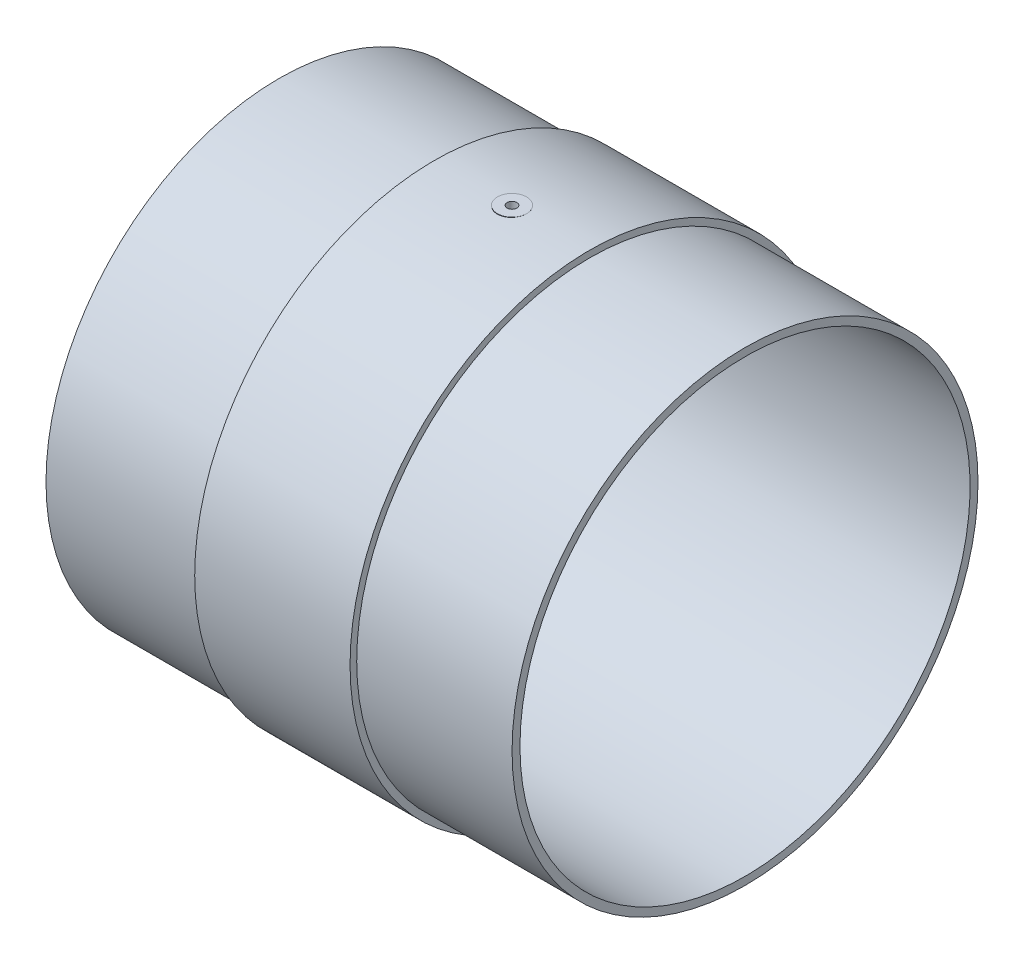
ISO-10303-21;
HEADER;
FILE_DESCRIPTION(('STEP AP214'),'2;1');
FILE_NAME('part.step','',(''),(''),'','','');
FILE_SCHEMA(('AUTOMOTIVE_DESIGN { 1 0 10303 214 1 1 1 1 }'));
ENDSEC;
DATA;
#1=APPLICATION_CONTEXT('core data for automotive mechanical design processes');
#2=APPLICATION_PROTOCOL_DEFINITION('international standard','automotive_design',2000,#1);
#3=PRODUCT_CONTEXT('',#1,'mechanical');
#4=PRODUCT('Part','Part','',(#3));
#5=PRODUCT_RELATED_PRODUCT_CATEGORY('part','',(#4));
#6=PRODUCT_DEFINITION_FORMATION('','',#4);
#7=PRODUCT_DEFINITION_CONTEXT('part definition',#1,'design');
#8=PRODUCT_DEFINITION('design','',#6,#7);
#9=PRODUCT_DEFINITION_SHAPE('','',#8);
#10=(LENGTH_UNIT() NAMED_UNIT(*) SI_UNIT(.MILLI.,.METRE.));
#11=(NAMED_UNIT(*) PLANE_ANGLE_UNIT() SI_UNIT($,.RADIAN.));
#12=(NAMED_UNIT(*) SI_UNIT($,.STERADIAN.) SOLID_ANGLE_UNIT());
#13=UNCERTAINTY_MEASURE_WITH_UNIT(LENGTH_MEASURE(1.E-05),#10,'distance_accuracy_value','');
#14=(GEOMETRIC_REPRESENTATION_CONTEXT(3) GLOBAL_UNCERTAINTY_ASSIGNED_CONTEXT((#13)) GLOBAL_UNIT_ASSIGNED_CONTEXT((#10,
#11,#12)) REPRESENTATION_CONTEXT('',''));
#15=CARTESIAN_POINT('',(0.,0.,0.));
#16=DIRECTION('',(0.,0.,1.));
#17=DIRECTION('',(1.,0.,0.));
#18=AXIS2_PLACEMENT_3D('',#15,#16,#17);
#19=CARTESIAN_POINT('',(-6.35,150.114,0.));
#20=DIRECTION('',(0.,-1.,0.));
#21=DIRECTION('',(0.,0.,-1.));
#22=AXIS2_PLACEMENT_3D('',#19,#20,#21);
#23=PLANE('',#22);
#24=CARTESIAN_POINT('',(0.,150.114,0.));
#25=DIRECTION('',(0.,-1.,0.));
#26=DIRECTION('',(0.,0.,-1.));
#27=AXIS2_PLACEMENT_3D('',#24,#25,#26);
#28=CIRCLE('',#27,9.525);
#29=CARTESIAN_POINT('',(0.,150.114,-9.525));
#30=VERTEX_POINT('',#29);
#31=EDGE_CURVE('E11',#30,#30,#28,.T.);
#32=ORIENTED_EDGE('',*,*,#31,.F.);
#33=EDGE_LOOP('',(#32));
#34=FACE_BOUND('',#33,.T.);
#35=CARTESIAN_POINT('',(0.,150.114,0.));
#36=DIRECTION('',(0.,-1.,0.));
#37=DIRECTION('',(0.,0.,-1.));
#38=AXIS2_PLACEMENT_3D('',#35,#36,#37);
#39=CIRCLE('',#38,6.35);
#40=CARTESIAN_POINT('',(0.,150.114,-6.35));
#41=VERTEX_POINT('',#40);
#42=EDGE_CURVE('E80',#41,#41,#39,.T.);
#43=ORIENTED_EDGE('',*,*,#42,.T.);
#44=EDGE_LOOP('',(#43));
#45=FACE_BOUND('',#44,.T.);
#46=ADVANCED_FACE('F52',(#34,#45),#23,.F.);
#47=CARTESIAN_POINT('',(0.,0.,0.));
#48=DIRECTION('',(0.,-1.,0.));
#49=DIRECTION('',(0.,0.,-1.));
#50=AXIS2_PLACEMENT_3D('',#47,#48,#49);
#51=CYLINDRICAL_SURFACE('',#50,9.525);
#52=CARTESIAN_POINT('',(0.,146.812,0.));
#53=DIRECTION('',(0.,-1.,0.));
#54=DIRECTION('',(0.,0.,-1.));
#55=AXIS2_PLACEMENT_3D('',#52,#53,#54);
#56=CIRCLE('',#55,9.525);
#57=CARTESIAN_POINT('',(0.,146.812,-9.525));
#58=VERTEX_POINT('',#57);
#59=EDGE_CURVE('E58',#58,#58,#56,.T.);
#60=ORIENTED_EDGE('',*,*,#59,.F.);
#61=EDGE_LOOP('',(#60));
#62=FACE_BOUND('',#61,.T.);
#63=ORIENTED_EDGE('',*,*,#31,.T.);
#64=EDGE_LOOP('',(#63));
#65=FACE_BOUND('',#64,.T.);
#66=ADVANCED_FACE('F117',(#62,#65),#51,.T.);
#67=CARTESIAN_POINT('',(-9.525,146.812,0.));
#68=DIRECTION('',(0.,1.,0.));
#69=DIRECTION('',(0.,0.,1.));
#70=AXIS2_PLACEMENT_3D('',#67,#68,#69);
#71=PLANE('',#70);
#72=CARTESIAN_POINT('',(0.,146.812,0.));
#73=DIRECTION('',(0.,-1.,0.));
#74=DIRECTION('',(0.,0.,-1.));
#75=AXIS2_PLACEMENT_3D('',#72,#73,#74);
#76=CIRCLE('',#75,3.175);
#77=CARTESIAN_POINT('',(0.,146.812,-3.175));
#78=VERTEX_POINT('',#77);
#79=EDGE_CURVE('E62',#78,#78,#76,.T.);
#80=ORIENTED_EDGE('',*,*,#79,.F.);
#81=EDGE_LOOP('',(#80));
#82=FACE_BOUND('',#81,.T.);
#83=ORIENTED_EDGE('',*,*,#59,.T.);
#84=EDGE_LOOP('',(#83));
#85=FACE_BOUND('',#84,.T.);
#86=ADVANCED_FACE('F112',(#82,#85),#71,.F.);
#87=CARTESIAN_POINT('',(0.,0.,0.));
#88=DIRECTION('',(0.,-1.,0.));
#89=DIRECTION('',(0.,0.,-1.));
#90=AXIS2_PLACEMENT_3D('',#87,#88,#89);
#91=CYLINDRICAL_SURFACE('',#90,3.175);
#92=CARTESIAN_POINT('',(0.,156.718,0.));
#93=DIRECTION('',(0.,-1.,0.));
#94=DIRECTION('',(0.,0.,-1.));
#95=AXIS2_PLACEMENT_3D('',#92,#93,#94);
#96=CIRCLE('',#95,3.175);
#97=CARTESIAN_POINT('',(0.,156.718,-3.175));
#98=VERTEX_POINT('',#97);
#99=EDGE_CURVE('E66',#98,#98,#96,.T.);
#100=ORIENTED_EDGE('',*,*,#99,.F.);
#101=EDGE_LOOP('',(#100));
#102=FACE_BOUND('',#101,.T.);
#103=ORIENTED_EDGE('',*,*,#79,.T.);
#104=EDGE_LOOP('',(#103));
#105=FACE_BOUND('',#104,.T.);
#106=ADVANCED_FACE('F106',(#102,#105),#91,.F.);
#107=CARTESIAN_POINT('',(-3.175,156.718,0.));
#108=DIRECTION('',(0.,-1.,0.));
#109=DIRECTION('',(0.,0.,-1.));
#110=AXIS2_PLACEMENT_3D('',#107,#108,#109);
#111=PLANE('',#110);
#112=CARTESIAN_POINT('',(0.,156.718,0.));
#113=DIRECTION('',(0.,-1.,0.));
#114=DIRECTION('',(0.,0.,-1.));
#115=AXIS2_PLACEMENT_3D('',#112,#113,#114);
#116=CIRCLE('',#115,9.525);
#117=CARTESIAN_POINT('',(0.,156.718,-9.525));
#118=VERTEX_POINT('',#117);
#119=EDGE_CURVE('E71',#118,#118,#116,.T.);
#120=ORIENTED_EDGE('',*,*,#119,.F.);
#121=EDGE_LOOP('',(#120));
#122=FACE_BOUND('',#121,.T.);
#123=ORIENTED_EDGE('',*,*,#99,.T.);
#124=EDGE_LOOP('',(#123));
#125=FACE_BOUND('',#124,.T.);
#126=ADVANCED_FACE('F100',(#122,#125),#111,.F.);
#127=CARTESIAN_POINT('',(0.,0.,0.));
#128=DIRECTION('',(0.,-1.,0.));
#129=DIRECTION('',(0.,0.,-1.));
#130=AXIS2_PLACEMENT_3D('',#127,#128,#129);
#131=CYLINDRICAL_SURFACE('',#130,9.525);
#132=CARTESIAN_POINT('',(0.,153.416,0.));
#133=DIRECTION('',(0.,-1.,0.));
#134=DIRECTION('',(0.,0.,-1.));
#135=AXIS2_PLACEMENT_3D('',#132,#133,#134);
#136=CIRCLE('',#135,9.525);
#137=CARTESIAN_POINT('',(0.,153.416,-9.525));
#138=VERTEX_POINT('',#137);
#139=EDGE_CURVE('E74',#138,#138,#136,.T.);
#140=ORIENTED_EDGE('',*,*,#139,.F.);
#141=EDGE_LOOP('',(#140));
#142=FACE_BOUND('',#141,.T.);
#143=ORIENTED_EDGE('',*,*,#119,.T.);
#144=EDGE_LOOP('',(#143));
#145=FACE_BOUND('',#144,.T.);
#146=ADVANCED_FACE('F94',(#142,#145),#131,.T.);
#147=CARTESIAN_POINT('',(-9.525,153.416,0.));
#148=DIRECTION('',(0.,1.,0.));
#149=DIRECTION('',(0.,0.,1.));
#150=AXIS2_PLACEMENT_3D('',#147,#148,#149);
#151=PLANE('',#150);
#152=CARTESIAN_POINT('',(0.,153.416,0.));
#153=DIRECTION('',(0.,-1.,0.));
#154=DIRECTION('',(0.,0.,-1.));
#155=AXIS2_PLACEMENT_3D('',#152,#153,#154);
#156=CIRCLE('',#155,6.35);
#157=CARTESIAN_POINT('',(0.,153.416,-6.35));
#158=VERTEX_POINT('',#157);
#159=EDGE_CURVE('E77',#158,#158,#156,.T.);
#160=ORIENTED_EDGE('',*,*,#159,.F.);
#161=EDGE_LOOP('',(#160));
#162=FACE_BOUND('',#161,.T.);
#163=ORIENTED_EDGE('',*,*,#139,.T.);
#164=EDGE_LOOP('',(#163));
#165=FACE_BOUND('',#164,.T.);
#166=ADVANCED_FACE('F88',(#162,#165),#151,.F.);
#167=CARTESIAN_POINT('',(0.,0.,0.));
#168=DIRECTION('',(0.,-1.,0.));
#169=DIRECTION('',(0.,0.,-1.));
#170=AXIS2_PLACEMENT_3D('',#167,#168,#169);
#171=CYLINDRICAL_SURFACE('',#170,6.35);
#172=ORIENTED_EDGE('',*,*,#42,.F.);
#173=EDGE_LOOP('',(#172));
#174=FACE_BOUND('',#173,.T.);
#175=ORIENTED_EDGE('',*,*,#159,.T.);
#176=EDGE_LOOP('',(#175));
#177=FACE_BOUND('',#176,.T.);
#178=ADVANCED_FACE('F85',(#174,#177),#171,.T.);
#179=CLOSED_SHELL('',(#46,#66,#86,#106,#126,#146,#166,#178));
#180=MANIFOLD_SOLID_BREP('B2',#179);
#181=CARTESIAN_POINT('',(-149.452065875916,0.,0.));
#182=DIRECTION('',(-1.,0.,0.));
#183=DIRECTION('',(0.,0.,1.));
#184=AXIS2_PLACEMENT_3D('',#181,#182,#183);
#185=CYLINDRICAL_SURFACE('',#184,156.718);
#186=CARTESIAN_POINT('',(50.8,0.,0.));
#187=DIRECTION('',(-1.,0.,0.));
#188=DIRECTION('',(0.,0.,1.));
#189=AXIS2_PLACEMENT_3D('',#186,#187,#188);
#190=CIRCLE('',#189,156.718);
#191=CARTESIAN_POINT('',(50.8,0.,156.718));
#192=VERTEX_POINT('',#191);
#193=EDGE_CURVE('E203',#192,#192,#190,.T.);
#194=ORIENTED_EDGE('',*,*,#193,.T.);
#195=EDGE_LOOP('',(#194));
#196=FACE_BOUND('',#195,.T.);
#197=CARTESIAN_POINT('',(-50.8,0.,0.));
#198=DIRECTION('',(-1.,0.,0.));
#199=DIRECTION('',(0.,0.,1.));
#200=AXIS2_PLACEMENT_3D('',#197,#198,#199);
#201=CIRCLE('',#200,156.718);
#202=CARTESIAN_POINT('',(-50.8,0.,156.718));
#203=VERTEX_POINT('',#202);
#204=EDGE_CURVE('E184',#203,#203,#201,.T.);
#205=ORIENTED_EDGE('',*,*,#204,.F.);
#206=EDGE_LOOP('',(#205));
#207=FACE_BOUND('',#206,.T.);
#208=CARTESIAN_POINT('',(-9.525,156.718,0.));
#209=CARTESIAN_POINT('',(-9.52500217038105,156.718000363997,-0.267342653931346));
#210=CARTESIAN_POINT('',(-9.51374006126548,156.717314496973,-0.534650645836345));
#211=CARTESIAN_POINT('',(-9.46877206428019,156.714590966698,-1.0674521592862));
#212=CARTESIAN_POINT('',(-9.43506046412577,156.712552959394,-1.33294520164153));
#213=CARTESIAN_POINT('',(-9.34538119796286,156.707179324834,-1.86040900175887));
#214=CARTESIAN_POINT('',(-9.28939061322089,156.703842361398,-2.12237584426583));
#215=CARTESIAN_POINT('',(-9.15555575880944,156.695965619827,-2.64065400372578));
#216=CARTESIAN_POINT('',(-9.07771109362001,156.691425819923,-2.89696521823141));
#217=CARTESIAN_POINT('',(-8.90077478669608,156.681274890491,-3.4019668715211));
#218=CARTESIAN_POINT('',(-8.80169471605812,156.67566434459,-3.65066137661179));
#219=CARTESIAN_POINT('',(-8.58296878393986,156.663529056122,-4.13881710348228));
#220=CARTESIAN_POINT('',(-8.46332261038837,156.657004299682,-4.37827818508608));
#221=CARTESIAN_POINT('',(-8.20434879748069,156.643226894244,-4.8462125782748));
#222=CARTESIAN_POINT('',(-8.06502588982297,156.635974420362,-5.07468851382289));
#223=CARTESIAN_POINT('',(-7.76766580153529,156.620945251332,-5.51910088404581));
#224=CARTESIAN_POINT('',(-7.60962859540934,156.613168555471,-5.73503730163646));
#225=CARTESIAN_POINT('',(-7.27574945752687,156.597300739157,-6.15310890933161));
#226=CARTESIAN_POINT('',(-7.09988543836088,156.589209236496,-6.35522644588332));
#227=CARTESIAN_POINT('',(-6.73176364425395,156.572950215034,-6.74393320866708));
#228=CARTESIAN_POINT('',(-6.53950584127373,156.564782696102,-6.930522408339));
#229=CARTESIAN_POINT('',(-6.13994669232155,156.548602697898,-7.28686073514025));
#230=CARTESIAN_POINT('',(-5.93264456570472,156.540590226698,-7.45660898731512));
#231=CARTESIAN_POINT('',(-5.504476690543,156.524948181221,-7.77804746991813));
#232=CARTESIAN_POINT('',(-5.2836112326182,156.517318598746,-7.92973808706084));
#233=CARTESIAN_POINT('',(-4.82969967928947,156.502653054159,-8.21409796394327));
#234=CARTESIAN_POINT('',(-4.59664428799725,156.495617556099,-8.34675240964369));
#235=CARTESIAN_POINT('',(-4.12016322033992,156.482347050259,-8.59195376475454));
#236=CARTESIAN_POINT('',(-3.87673753670875,156.476112043038,-8.70450066007611));
#237=CARTESIAN_POINT('',(-3.38124747226781,156.46462027337,-8.90868058606694));
#238=CARTESIAN_POINT('',(-3.12918316364767,156.45936350275,-9.00031379145478));
#239=CARTESIAN_POINT('',(-2.61820791887208,156.449978160705,-9.16200973128242));
#240=CARTESIAN_POINT('',(-2.35929699171926,156.445849587796,-9.23207249408372));
#241=CARTESIAN_POINT('',(-1.83680021055349,156.438842955022,-9.35004978461616));
#242=CARTESIAN_POINT('',(-1.57322058948629,156.435963342023,-9.39799182515209));
#243=CARTESIAN_POINT('',(-1.04294948207278,156.431529283601,-9.47151145810046));
#244=CARTESIAN_POINT('',(-0.776257998044552,156.429974837192,-9.49708906717163));
#245=CARTESIAN_POINT('',(-0.241666571794378,156.42823548646,-9.52569541802202));
#246=CARTESIAN_POINT('',(0.0262333586139533,156.428050568777,-9.52872437975801));
#247=CARTESIAN_POINT('',(0.561334042864808,156.429055521931,-9.51221216623992));
#248=CARTESIAN_POINT('',(0.828534797200157,156.430245391798,-9.49267100689908));
#249=CARTESIAN_POINT('',(1.3599783854429,156.433963468585,-9.43120043040231));
#250=CARTESIAN_POINT('',(1.62422468133251,156.436489893054,-9.38930083018199));
#251=CARTESIAN_POINT('',(2.14824306084206,156.442808093993,-9.28343295826614));
#252=CARTESIAN_POINT('',(2.40801514905794,156.446599869165,-9.21946470924111));
#253=CARTESIAN_POINT('',(2.92124347121409,156.45534099067,-9.0699175263147));
#254=CARTESIAN_POINT('',(3.17469967812647,156.460290341957,-8.98433849995061));
#255=CARTESIAN_POINT('',(3.67350011626747,156.4712060537,-8.79218139501373));
#256=CARTESIAN_POINT('',(3.91884433937325,156.477172415175,-8.68560329541451));
#257=CARTESIAN_POINT('',(4.39984617959543,156.48995718139,-8.45212957919197));
#258=CARTESIAN_POINT('',(4.63549723218772,156.496776151317,-8.32522046946886));
#259=CARTESIAN_POINT('',(5.09527332944085,156.511069583777,-8.05203828396552));
#260=CARTESIAN_POINT('',(5.31939837076128,156.518544046499,-7.90576520257338));
#261=CARTESIAN_POINT('',(5.75454180669173,156.533936773134,-7.59489120114708));
#262=CARTESIAN_POINT('',(5.96556008390504,156.54185504102,-7.43029011698668));
#263=CARTESIAN_POINT('',(6.37299864791713,156.557911211831,-7.08392596316644));
#264=CARTESIAN_POINT('',(6.56941891896868,156.566049114991,-6.90216287499402));
#265=CARTESIAN_POINT('',(6.9465809131596,156.582327612934,-6.52245066601622));
#266=CARTESIAN_POINT('',(7.12729667054476,156.590468190645,-6.32447575208424));
#267=CARTESIAN_POINT('',(7.47141056551634,156.606507926566,-5.91399829641452));
#268=CARTESIAN_POINT('',(7.63480868310718,156.614407084497,-5.7014957379031));
#269=CARTESIAN_POINT('',(7.94312701307535,156.629739990421,-5.2634675290488));
#270=CARTESIAN_POINT('',(8.08804720628557,156.63717373793,-5.03794186519745));
#271=CARTESIAN_POINT('',(8.35837782210742,156.651364980317,-4.57546563607123));
#272=CARTESIAN_POINT('',(8.48378825442525,156.658122475531,-4.33851507648039));
#273=CARTESIAN_POINT('',(8.71420992092635,156.670769804193,-3.85485777972268));
#274=CARTESIAN_POINT('',(8.81922014740766,156.676659594776,-3.60815056133362));
#275=CARTESIAN_POINT('',(9.0080817730687,156.687403899691,-3.10674379644892));
#276=CARTESIAN_POINT('',(9.09193316762588,156.692258413796,-2.85204424820723));
#277=CARTESIAN_POINT('',(9.23787425580378,156.700794215348,-2.33646804531156));
#278=CARTESIAN_POINT('',(9.29996414615567,156.7044755134,-2.07559144652291));
#279=CARTESIAN_POINT('',(9.40193616964568,156.710560296023,-1.54951883839671));
#280=CARTESIAN_POINT('',(9.44181833313278,156.71296378234,-1.28432283496256));
#281=CARTESIAN_POINT('',(9.49904160836233,156.716421839569,-0.751929816113848));
#282=CARTESIAN_POINT('',(9.51641860184286,156.717478557695,-0.484736670817903));
#283=CARTESIAN_POINT('',(9.52862401415682,156.718220181688,0.0501659001066919));
#284=CARTESIAN_POINT('',(9.52345245685124,156.717905089008,0.317875325188712));
#285=CARTESIAN_POINT('',(9.49059811672319,156.715912032272,0.851902767252378));
#286=CARTESIAN_POINT('',(9.46291544061249,156.714234074677,1.1182207908238));
#287=CARTESIAN_POINT('',(9.38523819711953,156.709562870532,1.64757103945721));
#288=CARTESIAN_POINT('',(9.33524363197601,156.706569624115,1.91060326484889));
#289=CARTESIAN_POINT('',(9.21334772715379,156.699355395497,2.43131550823892));
#290=CARTESIAN_POINT('',(9.14146287737345,156.695135337558,2.68899939958508));
#291=CARTESIAN_POINT('',(8.97628814302908,156.685585987219,3.19739151189055));
#292=CARTESIAN_POINT('',(8.88299827308463,156.680256695578,3.44809973761409));
#293=CARTESIAN_POINT('',(8.67569675207834,156.668640489409,3.94072486547807));
#294=CARTESIAN_POINT('',(8.56168856233668,156.66235373487,4.1826432280143));
#295=CARTESIAN_POINT('',(8.3137079434863,156.648997165852,4.65610627516829));
#296=CARTESIAN_POINT('',(8.17972857292108,156.641927079329,4.88764731636234));
#297=CARTESIAN_POINT('',(7.89262967573496,156.62719731002,5.3388770400023));
#298=CARTESIAN_POINT('',(7.73948948255876,156.619536994102,5.55855255256209));
#299=CARTESIAN_POINT('',(7.41527026065044,156.603850285459,5.9842268841943));
#300=CARTESIAN_POINT('',(7.24419120995308,156.595823892285,6.19022568651977));
#301=CARTESIAN_POINT('',(6.88527292514717,156.579630690176,6.58712706188821));
#302=CARTESIAN_POINT('',(6.69743064833837,156.571463855966,6.77802688239864));
#303=CARTESIAN_POINT('',(6.30640912665803,156.555225273031,7.14327518007824));
#304=CARTESIAN_POINT('',(6.10323522461985,156.547153492305,7.31762937575968));
#305=CARTESIAN_POINT('',(5.68261513276685,156.531318882563,7.64887427442053));
#306=CARTESIAN_POINT('',(5.46514815300849,156.523556531203,7.80573860220986));
#307=CARTESIAN_POINT('',(5.01775410658433,156.508574145163,8.10058907629041));
#308=CARTESIAN_POINT('',(4.78782702723876,156.501354111035,8.23857520337009));
#309=CARTESIAN_POINT('',(4.31714444897962,156.48766183348,8.49468492181945));
#310=CARTESIAN_POINT('',(4.07638899792282,156.481189586748,8.61280860096167));
#311=CARTESIAN_POINT('',(3.585758545763,156.46917724637,8.82834947465904));
#312=CARTESIAN_POINT('',(3.33588355394977,156.463637151774,8.92576669030651));
#313=CARTESIAN_POINT('',(2.82896482310025,156.453650564122,9.09913676357189));
#314=CARTESIAN_POINT('',(2.57192610710457,156.44920332524,9.17510426493586));
#315=CARTESIAN_POINT('',(2.05234516137283,156.441524374968,9.30511800741613));
#316=CARTESIAN_POINT('',(1.78980293331371,156.438292663207,9.35916425521182));
#317=CARTESIAN_POINT('',(1.26108783559362,156.433137050276,9.44494608046221));
#318=CARTESIAN_POINT('',(0.994914993528764,156.431213139172,9.4766818274016));
#319=CARTESIAN_POINT('',(0.460835647153957,156.428728058051,9.51761442363524));
#320=CARTESIAN_POINT('',(0.192929144817815,156.428166886482,9.52681129858588));
#321=CARTESIAN_POINT('',(-0.342270989594648,156.428423101328,9.52260331711775));
#322=CARTESIAN_POINT('',(-0.609564911277713,156.429238255146,9.50923506456327));
#323=CARTESIAN_POINT('',(-1.14207316242611,156.432219633075,9.46006286811603));
#324=CARTESIAN_POINT('',(-1.40728749429397,156.434385855626,9.42425895014671));
#325=CARTESIAN_POINT('',(-1.93375150964298,156.440007692361,9.33047267614364));
#326=CARTESIAN_POINT('',(-2.1950011887463,156.44346330797,9.27249029562188));
#327=CARTESIAN_POINT('',(-2.71168067106647,156.451565612074,9.13476297928539));
#328=CARTESIAN_POINT('',(-2.967110471368,156.456212301166,9.05501803256949));
#329=CARTESIAN_POINT('',(-3.47033466190252,156.466564587708,8.87433778843394));
#330=CARTESIAN_POINT('',(-3.71812918672545,156.472270166482,8.77340286478347));
#331=CARTESIAN_POINT('',(-4.20433922857345,156.48457845934,8.55105944169614));
#332=CARTESIAN_POINT('',(-4.44275453585677,156.491181193474,8.42965048473148));
#333=CARTESIAN_POINT('',(-4.90850638172188,156.505096224039,8.16722931996302));
#334=CARTESIAN_POINT('',(-5.13584335712036,156.51240849246,8.02621788592749));
#335=CARTESIAN_POINT('',(-5.57784433110863,156.527535763672,7.72558823651735));
#336=CARTESIAN_POINT('',(-5.7925083249547,156.535350766651,7.56597001417796));
#337=CARTESIAN_POINT('',(-6.20796265117162,156.55127446592,7.22900198690312));
#338=CARTESIAN_POINT('',(-6.40873159066079,156.559383587016,7.05162582563298));
#339=CARTESIAN_POINT('',(-6.79461994571074,156.575654516038,6.68059934754984));
#340=CARTESIAN_POINT('',(-6.97973934842791,156.583816324006,6.48694901738086));
#341=CARTESIAN_POINT('',(-7.33306298258678,156.5999634389,6.08469325551926));
#342=CARTESIAN_POINT('',(-7.5012629239696,156.607948700663,5.876084053742));
#343=CARTESIAN_POINT('',(-7.819498788896,156.623514175376,5.44543353612193));
#344=CARTESIAN_POINT('',(-7.96953498886058,156.631094394488,5.22339242476691));
#345=CARTESIAN_POINT('',(-8.25055067716232,156.645643929569,4.76716917556254));
#346=CARTESIAN_POINT('',(-8.38150679350722,156.65261249221,4.53297261617941));
#347=CARTESIAN_POINT('',(-8.62320667260336,156.665730213844,4.05435641765937));
#348=CARTESIAN_POINT('',(-8.73395080126292,156.671879387671,3.80993696369141));
#349=CARTESIAN_POINT('',(-8.93433241134129,156.683177740953,3.31286223413778));
#350=CARTESIAN_POINT('',(-9.02399172114119,156.688327953622,3.06021578701831));
#351=CARTESIAN_POINT('',(-9.18168585267821,156.697489038654,2.54833162500446));
#352=CARTESIAN_POINT('',(-9.24972622006156,156.701500203176,2.28909561890738));
#353=CARTESIAN_POINT('',(-9.37919323696386,156.70918876603,1.6947609195596));
#354=CARTESIAN_POINT('',(-9.4338221607241,156.712480642221,1.35815456346383));
#355=CARTESIAN_POINT('',(-9.50672413654311,156.716886026002,0.681013394571781));
#356=CARTESIAN_POINT('',(-9.5249972358759,156.717999536425,0.340478586884307));
#357=CARTESIAN_POINT('',(-9.525,156.718,0.));
#358=B_SPLINE_CURVE_WITH_KNOTS('',3,(#208,#209,#210,#211,#212,#213,#214,#215,#216,#217,#218,
#219,#220,#221,#222,#223,#224,#225,#226,#227,#228,#229,#230,#231,#232,#233,#234,#235,#236,#237,
#238,#239,#240,#241,#242,#243,#244,#245,#246,#247,#248,#249,#250,#251,#252,#253,#254,#255,#256,
#257,#258,#259,#260,#261,#262,#263,#264,#265,#266,#267,#268,#269,#270,#271,#272,#273,#274,#275,
#276,#277,#278,#279,#280,#281,#282,#283,#284,#285,#286,#287,#288,#289,#290,#291,#292,#293,#294,
#295,#296,#297,#298,#299,#300,#301,#302,#303,#304,#305,#306,#307,#308,#309,#310,#311,#312,#313,
#314,#315,#316,#317,#318,#319,#320,#321,#322,#323,#324,#325,#326,#327,#328,#329,#330,#331,#332,
#333,#334,#335,#336,#337,#338,#339,#340,#341,#342,#343,#344,#345,#346,#347,#348,#349,#350,#351,
#352,#353,#354,#355,#356,#357),.UNSPECIFIED.,.T.,.F.,(4,2,2,2,2,2,2,2,2,2,2,2,2,2,2,2,2,2,2,2,2,
2,2,2,2,2,2,2,2,2,2,2,2,2,2,2,2,2,2,2,2,2,2,2,2,2,2,2,2,2,2,2,2,2,2,2,2,2,2,2,2,2,2,2,2,2,2,2,2,
2,2,2,2,2,4),(0.,0.801730433334183,1.60366494538352,2.4064265614511,3.20920270701178,
4.01154252981044,4.81389452843313,5.61605391155992,6.4182143875447,7.22138117824364,
8.02454934267518,8.82775921307173,9.63095187917419,10.4347662428642,11.2385811697647,
12.0423893811339,12.8461965356268,13.6490012363719,14.4518053391264,15.2546016107044,
16.0573973162646,16.8591250893756,17.6608520388965,18.4625824187013,19.2643136012852,
20.0665790907738,20.8688448127692,21.6711177195875,22.4733914918244,23.2769674564035,
24.0805443488104,24.8841220747585,25.6876994009214,26.4913164110293,27.2949335967021,
28.0985435172232,28.9021523395318,29.7044783222168,30.5068034558766,31.3091247862143,
32.1114460360483,32.9131643880812,33.7148821925437,34.5164661804046,35.3183294302149,
36.1210651354368,36.9238018235797,37.7266845143099,38.529288693638,39.3330873027552,
40.1368867298573,40.9406826048607,41.7444776610858,42.5477226312517,43.3509673566691,
44.1542059800647,44.9574436891195,45.7593796835059,46.561314751292,47.3632507045251,
48.1651870594599,48.9671092702588,49.769049403776,50.5709578913059,51.3728666790023,
52.175983819613,52.979101619337,53.7824225451231,54.5857312442048,55.3900158227427,
56.1942858394468,56.9977195213246,57.8009469413637,58.8220051075036,59.8430619459453),.UNSPECIFIED.);
#359=CARTESIAN_POINT('',(-9.525,156.718,0.));
#360=VERTEX_POINT('',#359);
#361=EDGE_CURVE('E51',#360,#360,#358,.T.);
#362=ORIENTED_EDGE('',*,*,#361,.T.);
#363=EDGE_LOOP('',(#362));
#364=FACE_BOUND('',#363,.T.);
#365=ADVANCED_FACE('F173',(#196,#207,#364),#185,.T.);
#366=CARTESIAN_POINT('',(-149.452065875916,0.,0.));
#367=DIRECTION('',(-1.,0.,0.));
#368=DIRECTION('',(0.,0.,1.));
#369=AXIS2_PLACEMENT_3D('',#366,#367,#368);
#370=CYLINDRICAL_SURFACE('',#369,147.193);
#371=CARTESIAN_POINT('',(152.4,0.,0.));
#372=DIRECTION('',(-1.,0.,0.));
#373=DIRECTION('',(0.,0.,1.));
#374=AXIS2_PLACEMENT_3D('',#371,#372,#373);
#375=CIRCLE('',#374,147.193);
#376=CARTESIAN_POINT('',(152.4,0.,147.193));
#377=VERTEX_POINT('',#376);
#378=EDGE_CURVE('E256',#377,#377,#375,.T.);
#379=ORIENTED_EDGE('',*,*,#378,.F.);
#380=EDGE_LOOP('',(#379));
#381=FACE_BOUND('',#380,.T.);
#382=CARTESIAN_POINT('',(-152.4,0.,0.));
#383=DIRECTION('',(-1.,0.,0.));
#384=DIRECTION('',(0.,0.,1.));
#385=AXIS2_PLACEMENT_3D('',#382,#383,#384);
#386=CIRCLE('',#385,147.193);
#387=CARTESIAN_POINT('',(-152.4,0.,147.193));
#388=VERTEX_POINT('',#387);
#389=EDGE_CURVE('E259',#388,#388,#386,.T.);
#390=ORIENTED_EDGE('',*,*,#389,.T.);
#391=EDGE_LOOP('',(#390));
#392=FACE_BOUND('',#391,.T.);
#393=CARTESIAN_POINT('',(0.,146.884490753789,-9.525));
#394=CARTESIAN_POINT('',(-0.267306596249868,146.8844903575,-9.52500220474203));
#395=CARTESIAN_POINT('',(-0.534578109053908,146.885221959241,-9.51374311653239));
#396=CARTESIAN_POINT('',(-1.06730639433845,146.888126951077,-9.46878743216753));
#397=CARTESIAN_POINT('',(-1.33276268979046,146.890300706481,-9.43508515093992));
#398=CARTESIAN_POINT('',(-1.86015149726135,146.89603184985,-9.34543132452126));
#399=CARTESIAN_POINT('',(-2.12208011126995,146.899590656207,-9.28945696978744));
#400=CARTESIAN_POINT('',(-2.64028203303039,146.907990235114,-9.15566181016266));
#401=CARTESIAN_POINT('',(-2.89655523776977,146.912831030994,-9.07784060768819));
#402=CARTESIAN_POINT('',(-3.40148003686867,146.923653674889,-8.90095945516184));
#403=CARTESIAN_POINT('',(-3.65013574857261,146.929634893396,-8.80191121862404));
#404=CARTESIAN_POINT('',(-4.13821600608259,146.942570187411,-8.58325708501254));
#405=CARTESIAN_POINT('',(-4.37764041250343,146.949524277603,-8.46365087767889));
#406=CARTESIAN_POINT('',(-4.84550560536227,146.964206123869,-8.20476469000694));
#407=CARTESIAN_POINT('',(-5.07394899018313,146.97193369557,-8.06548939488665));
#408=CARTESIAN_POINT('',(-5.51830150886262,146.987944972667,-7.76823187856848));
#409=CARTESIAN_POINT('',(-5.73421062330648,146.996228678924,-7.61024962839587));
#410=CARTESIAN_POINT('',(-6.15226776249276,147.013129784884,-7.27646027427623));
#411=CARTESIAN_POINT('',(-6.35439590293706,147.021747639746,-7.10062828859094));
#412=CARTESIAN_POINT('',(-6.74312719556006,147.039061730215,-6.73257049854195));
#413=CARTESIAN_POINT('',(-6.92973031970098,147.047757965962,-6.54034466457266));
#414=CARTESIAN_POINT('',(-7.28610050556771,147.06498290447,-6.14084825831614));
#415=CARTESIAN_POINT('',(-7.45586668776142,147.07351159846,-5.93357690105585));
#416=CARTESIAN_POINT('',(-7.77734526376193,147.090159242055,-5.5054682356677));
#417=CARTESIAN_POINT('',(-7.92905804526019,147.098278200456,-5.28463121901284));
#418=CARTESIAN_POINT('',(-8.21348081868675,147.113883439646,-4.83075009265464));
#419=CARTESIAN_POINT('',(-8.34617406376065,147.121369160517,-4.59769546882424));
#420=CARTESIAN_POINT('',(-8.59145256916533,147.135487500389,-4.12120951079313));
#421=CARTESIAN_POINT('',(-8.70403781360372,147.142120118717,-3.87777816839133));
#422=CARTESIAN_POINT('',(-8.90829291318267,147.154343824849,-3.3822704795389));
#423=CARTESIAN_POINT('',(-8.99996295989689,147.159934922193,-3.13019421229615));
#424=CARTESIAN_POINT('',(-9.16173006572818,147.169916757104,-2.6191889235683));
#425=CARTESIAN_POINT('',(-9.23182715694592,147.174307496458,-2.36025991228074));
#426=CARTESIAN_POINT('',(-9.34985965839303,147.181758486407,-1.83776524723861));
#427=CARTESIAN_POINT('',(-9.39782626182032,147.184820609339,-1.57420666659949));
#428=CARTESIAN_POINT('',(-9.4713981260415,147.189536502485,-1.04397419050744));
#429=CARTESIAN_POINT('',(-9.49700340571677,147.191190273889,-0.77730029768521));
#430=CARTESIAN_POINT('',(-9.52566767437862,147.19304250875,-0.242741357596635));
#431=CARTESIAN_POINT('',(-9.52872690602171,147.19324098787,0.0251436766034977));
#432=CARTESIAN_POINT('',(-9.5122776097511,147.192177042591,0.560216921933381));
#433=CARTESIAN_POINT('',(-9.49276909975416,147.190914619352,0.827405133616178));
#434=CARTESIAN_POINT('',(-9.43137139183575,147.18696768388,1.35878031479884));
#435=CARTESIAN_POINT('',(-9.38951580531988,147.184285307397,1.62297118464339));
#436=CARTESIAN_POINT('',(-9.2837460252291,147.177575679029,2.14688194349867));
#437=CARTESIAN_POINT('',(-9.21983185724066,147.173548428703,2.40660183769506));
#438=CARTESIAN_POINT('',(-9.07040295698398,147.164262913288,2.91972996200865));
#439=CARTESIAN_POINT('',(-8.98488812485726,147.159004642509,3.17313816294134));
#440=CARTESIAN_POINT('',(-8.79286948088872,147.14740568776,3.67184792260633));
#441=CARTESIAN_POINT('',(-8.68636564540546,147.141065002572,3.91714947220714));
#442=CARTESIAN_POINT('',(-8.45306248922606,147.127476457073,4.39804765356697));
#443=CARTESIAN_POINT('',(-8.32625178848282,147.120228088593,4.63363874991411));
#444=CARTESIAN_POINT('',(-8.05322838285787,147.105028928356,5.09339210881788));
#445=CARTESIAN_POINT('',(-7.90700843433056,147.097077874726,5.3175500610114));
#446=CARTESIAN_POINT('',(-7.596303120331,147.080703688201,5.75267264906074));
#447=CARTESIAN_POINT('',(-7.43182513612196,147.072280746755,5.96364256297762));
#448=CARTESIAN_POINT('',(-7.08564015029329,147.055193818861,6.37109301069869));
#449=CARTESIAN_POINT('',(-6.90392536649575,147.046529724796,6.56756692790662));
#450=CARTESIAN_POINT('',(-6.52426450472568,147.029193141163,6.94487981657068));
#451=CARTESIAN_POINT('',(-6.3262892445069,147.020520665379,7.12568942614017));
#452=CARTESIAN_POINT('',(-5.91589237272,147.003433302208,7.46990885777162));
#453=CARTESIAN_POINT('',(-5.70347733083654,146.995018300172,7.63332650699248));
#454=CARTESIAN_POINT('',(-5.26553241318839,146.978677242549,7.94176017808441));
#455=CARTESIAN_POINT('',(-5.03999712289044,146.970751391648,8.08676852301399));
#456=CARTESIAN_POINT('',(-4.57757681787066,146.955620723032,8.35722039403769));
#457=CARTESIAN_POINT('',(-4.34069610007735,146.948415635482,8.48267125185972));
#458=CARTESIAN_POINT('',(-3.85712468337709,146.934926460661,8.71320716149251));
#459=CARTESIAN_POINT('',(-3.61043153157037,146.928642605542,8.81828708194982));
#460=CARTESIAN_POINT('',(-3.10904385104545,146.917177248032,9.00728866141453));
#461=CARTESIAN_POINT('',(-2.85434932031109,146.911995745919,9.09121031509048));
#462=CARTESIAN_POINT('',(-2.3387746428794,146.902883102872,9.23729108308589));
#463=CARTESIAN_POINT('',(-2.07789456010439,146.898951949024,9.29945042219541));
#464=CARTESIAN_POINT('',(-1.55180689572568,146.892452330714,9.40155937250674));
#465=CARTESIAN_POINT('',(-1.28659932086262,146.889883864129,9.44150901829968));
#466=CARTESIAN_POINT('',(-0.754234197437889,146.886186463611,9.4988578943571));
#467=CARTESIAN_POINT('',(-0.487081058533905,146.885054926957,9.51629789741996));
#468=CARTESIAN_POINT('',(0.0477472692097314,146.884255093984,9.52863543986317));
#469=CARTESIAN_POINT('',(0.315422457421548,146.884586795906,9.52353300633723));
#470=CARTESIAN_POINT('',(0.849386813072992,146.886703968033,9.49082260628797));
#471=CARTESIAN_POINT('',(1.11567598796497,146.888489430413,9.46321476089841));
#472=CARTESIAN_POINT('',(1.64497396863999,146.893463187825,9.38569268269356));
#473=CARTESIAN_POINT('',(1.90798277480426,146.896651482692,9.33577845247063));
#474=CARTESIAN_POINT('',(2.42862565268618,146.904336719547,9.2140551693974));
#475=CARTESIAN_POINT('',(2.68626414758025,146.90883253496,9.14226496258756));
#476=CARTESIAN_POINT('',(3.19457307649163,146.919006075437,8.97728948954979));
#477=CARTESIAN_POINT('',(3.44524351593597,146.92468379958,8.88410423998581));
#478=CARTESIAN_POINT('',(3.93780230113179,146.93705896716,8.67702142054615));
#479=CARTESIAN_POINT('',(4.17969209702274,146.943756241258,8.563127289622));
#480=CARTESIAN_POINT('',(4.65310859846414,146.957983910313,8.31538366017974));
#481=CARTESIAN_POINT('',(4.88463166347119,146.96551459477,8.18152722175011));
#482=CARTESIAN_POINT('',(5.33587746125299,146.981203880982,7.89465682003288));
#483=CARTESIAN_POINT('',(5.55558491259186,146.989363264193,7.74161886170659));
#484=CARTESIAN_POINT('',(5.98133233311318,147.006070298212,7.41760408888537));
#485=CARTESIAN_POINT('',(6.18737228331853,147.014617949559,7.24662724948346));
#486=CARTESIAN_POINT('',(6.58436626646717,147.031861032593,6.88791180979516));
#487=CARTESIAN_POINT('',(6.77531753395171,147.040556491017,6.7001701502161));
#488=CARTESIAN_POINT('',(7.14067945641599,147.057844504712,6.30934666527566));
#489=CARTESIAN_POINT('',(7.31509582443529,147.066437094623,6.10627018220037));
#490=CARTESIAN_POINT('',(7.64650556517447,147.083293505341,5.68580275073854));
#491=CARTESIAN_POINT('',(7.80346943530525,147.091556754731,5.46838852433214));
#492=CARTESIAN_POINT('',(8.09852299693157,147.107504867354,5.02108890235996));
#493=CARTESIAN_POINT('',(8.23661266662583,147.115189729919,4.79120349238934));
#494=CARTESIAN_POINT('',(8.49293228891327,147.129762937951,4.32059246563161));
#495=CARTESIAN_POINT('',(8.61116233800103,147.136651287288,4.0798669015222));
#496=CARTESIAN_POINT('',(8.82691742548601,147.149435916708,3.58928390950402));
#497=CARTESIAN_POINT('',(8.92444248779428,147.155332197936,3.33942649214153));
#498=CARTESIAN_POINT('',(9.09802000792446,147.165961035182,2.8325541975441));
#499=CARTESIAN_POINT('',(9.17408910121374,147.170694492402,2.57554503608768));
#500=CARTESIAN_POINT('',(9.30430848267793,147.178869246477,2.05601223243728));
#501=CARTESIAN_POINT('',(9.35845877843768,147.182310543779,1.79348859215159));
#502=CARTESIAN_POINT('',(9.44444972476975,147.187803197736,1.26480044258969));
#503=CARTESIAN_POINT('',(9.476290571135,147.18985456659,0.998635965287209));
#504=CARTESIAN_POINT('',(9.51743331362743,147.192509108632,0.464563607363644));
#505=CARTESIAN_POINT('',(9.52673523870514,147.19311228368,0.196655728982343));
#506=CARTESIAN_POINT('',(9.52273668147656,147.192853544237,-0.338500013975747));
#507=CARTESIAN_POINT('',(9.50947751065861,147.191994307558,-0.605748189461628));
#508=CARTESIAN_POINT('',(9.46053133910938,147.18884021086,-1.13817389587487));
#509=CARTESIAN_POINT('',(9.42484436765884,147.186545352714,-1.40335142950511));
#510=CARTESIAN_POINT('',(9.3312993752399,147.180584986454,-1.92975101352366));
#511=CARTESIAN_POINT('',(9.27344133391137,147.17691947708,-2.19097306027933));
#512=CARTESIAN_POINT('',(9.13596967444074,147.168321540461,-2.70760697127717));
#513=CARTESIAN_POINT('',(9.05635604403283,147.163389112502,-2.96301883224346));
#514=CARTESIAN_POINT('',(8.87594554413157,147.15239696811,-3.46621593957432));
#515=CARTESIAN_POINT('',(8.7751491842407,147.146337278796,-3.714001369247));
#516=CARTESIAN_POINT('',(8.55308904610196,147.133261633821,-4.20020483431719));
#517=CARTESIAN_POINT('',(8.43182480694334,147.126245656625,-4.438622658619));
#518=CARTESIAN_POINT('',(8.16969813197532,147.111455972581,-4.90439270627585));
#519=CARTESIAN_POINT('',(8.02883644490934,147.103682294686,-5.13174535194125));
#520=CARTESIAN_POINT('',(7.7285101227434,147.087596411624,-5.57379196044447));
#521=CARTESIAN_POINT('',(7.56904547734188,147.079284206159,-5.78848591627232));
#522=CARTESIAN_POINT('',(7.23235221497008,147.062341324127,-6.20405870790055));
#523=CARTESIAN_POINT('',(7.05509363772668,147.053710126436,-6.40491324966151));
#524=CARTESIAN_POINT('',(6.68429577803295,147.036387152485,-6.79098302463955));
#525=CARTESIAN_POINT('',(6.49075648041235,147.027695376169,-6.97619824328367));
#526=CARTESIAN_POINT('',(6.08871471704537,147.010495326395,-7.32972376114436));
#527=CARTESIAN_POINT('',(5.88020848565236,147.001987099824,-7.49802978030483));
#528=CARTESIAN_POINT('',(5.44975398940106,146.985397911314,-7.81648785212122));
#529=CARTESIAN_POINT('',(5.22780592803284,146.977316942911,-7.96664017949498));
#530=CARTESIAN_POINT('',(4.77173356309384,146.961801389396,-8.24791223761018));
#531=CARTESIAN_POINT('',(4.53759358675006,146.954367670833,-8.37900660573215));
#532=CARTESIAN_POINT('',(4.05907559850484,146.940370657525,-8.62098689189074));
#533=CARTESIAN_POINT('',(3.81469777300134,146.933807346942,-8.73187317765436));
#534=CARTESIAN_POINT('',(3.31768989933095,146.921744667651,-8.93254150793986));
#535=CARTESIAN_POINT('',(3.06506866763531,146.916244203159,-9.02234530906946));
#536=CARTESIAN_POINT('',(2.55321948461156,146.906456856135,-9.18032862178413));
#537=CARTESIAN_POINT('',(2.29399324042288,146.902169663421,-9.24851366094237));
#538=CARTESIAN_POINT('',(1.69888523744825,146.893937339676,-9.3784772755447));
#539=CARTESIAN_POINT('',(1.36147241772501,146.890408246422,-9.43337414059882));
#540=CARTESIAN_POINT('',(0.682687328129457,146.885685208238,-9.5066340677793));
#541=CARTESIAN_POINT('',(0.341315064211245,146.884491259798,-9.52499718483689));
#542=CARTESIAN_POINT('',(0.,146.884490753789,-9.525));
#543=B_SPLINE_CURVE_WITH_KNOTS('',3,(#393,#394,#395,#396,#397,#398,#399,#400,#401,#402,#403,
#404,#405,#406,#407,#408,#409,#410,#411,#412,#413,#414,#415,#416,#417,#418,#419,#420,#421,#422,
#423,#424,#425,#426,#427,#428,#429,#430,#431,#432,#433,#434,#435,#436,#437,#438,#439,#440,#441,
#442,#443,#444,#445,#446,#447,#448,#449,#450,#451,#452,#453,#454,#455,#456,#457,#458,#459,#460,
#461,#462,#463,#464,#465,#466,#467,#468,#469,#470,#471,#472,#473,#474,#475,#476,#477,#478,#479,
#480,#481,#482,#483,#484,#485,#486,#487,#488,#489,#490,#491,#492,#493,#494,#495,#496,#497,#498,
#499,#500,#501,#502,#503,#504,#505,#506,#507,#508,#509,#510,#511,#512,#513,#514,#515,#516,#517,
#518,#519,#520,#521,#522,#523,#524,#525,#526,#527,#528,#529,#530,#531,#532,#533,#534,#535,#536,
#537,#538,#539,#540,#541,#542),.UNSPECIFIED.,.T.,.F.,(4,2,2,2,2,2,2,2,2,2,2,2,2,2,2,2,2,2,2,2,2,
2,2,2,2,2,2,2,2,2,2,2,2,2,2,2,2,2,2,2,2,2,2,2,2,2,2,2,2,2,2,2,2,2,2,2,2,2,2,2,2,2,2,2,2,2,2,2,2,
2,2,2,2,2,4),(0.,0.801621509004891,1.60344615357568,2.40609409475295,3.20875664399912,
4.01097740279988,4.8132102697425,5.61525236444105,6.41729570141821,7.22047281679603,
8.02365138265963,8.82687188307842,9.63007513146041,10.4339813185139,11.2378881409334,
12.0417875996381,12.8456858621306,13.6484475320627,14.4512085241611,15.2539608763654,
16.0567125912568,16.8582603045179,17.6598070880411,18.4613575771317,19.2629089690721,
20.0649111357452,20.8672134603297,21.6691926075264,22.4715355764821,23.2753513446176,
24.0788038162363,24.8825902460054,25.6860746232492,26.4897611325922,27.2934478444476,
28.0971262545154,28.9008034128681,29.70302277967,30.5052411822864,31.3074552670488,
32.109669258581,32.9111940914671,33.7127183000723,34.5141095275854,35.3157800116608,
36.1184635426556,36.9211481881397,37.7239796103353,38.5265326242495,39.3304223249144,
40.1343129541314,40.9381996772648,41.7420854720284,42.5453462654981,43.3486067810049,
44.1518602468212,44.9551126808832,45.7568958665005,46.5586780053478,47.3604608804897,
48.1622442076783,48.9640082482114,49.7657903458659,50.5675418189059,51.3692937359253,
52.1724189849658,52.9755449823617,53.7788737575114,54.5821903744523,55.3865664583162,
56.190927903466,56.9944555821084,57.7977776455304,58.8213435135072,59.8449078424749),.UNSPECIFIED.);
#544=CARTESIAN_POINT('',(0.,146.884490753789,-9.525));
#545=VERTEX_POINT('',#544);
#546=EDGE_CURVE('E196',#545,#545,#543,.T.);
#547=ORIENTED_EDGE('',*,*,#546,.T.);
#548=EDGE_LOOP('',(#547));
#549=FACE_BOUND('',#548,.T.);
#550=ADVANCED_FACE('F205',(#381,#392,#549),#370,.F.);
#551=CARTESIAN_POINT('',(-50.8,0.,0.));
#552=DIRECTION('',(1.,0.,0.));
#553=DIRECTION('',(0.,0.,-1.));
#554=AXIS2_PLACEMENT_3D('',#551,#552,#553);
#555=PLANE('',#554);
#556=CARTESIAN_POINT('',(-50.8,0.,0.));
#557=DIRECTION('',(-1.,0.,0.));
#558=DIRECTION('',(0.,0.,1.));
#559=AXIS2_PLACEMENT_3D('',#556,#557,#558);
#560=CIRCLE('',#559,152.364930728312);
#561=CARTESIAN_POINT('',(-50.8,0.,152.364930728312));
#562=VERTEX_POINT('',#561);
#563=EDGE_CURVE('E188',#562,#562,#560,.T.);
#564=ORIENTED_EDGE('',*,*,#563,.F.);
#565=EDGE_LOOP('',(#564));
#566=FACE_BOUND('',#565,.T.);
#567=ORIENTED_EDGE('',*,*,#204,.T.);
#568=EDGE_LOOP('',(#567));
#569=FACE_BOUND('',#568,.T.);
#570=ADVANCED_FACE('F240',(#566,#569),#555,.F.);
#571=CARTESIAN_POINT('',(-149.452065875916,0.,0.));
#572=DIRECTION('',(-1.,0.,0.));
#573=DIRECTION('',(0.,0.,1.));
#574=AXIS2_PLACEMENT_3D('',#571,#572,#573);
#575=CYLINDRICAL_SURFACE('',#574,152.364930728312);
#576=CARTESIAN_POINT('',(-152.4,0.,0.));
#577=DIRECTION('',(-1.,0.,0.));
#578=DIRECTION('',(0.,0.,1.));
#579=AXIS2_PLACEMENT_3D('',#576,#577,#578);
#580=CIRCLE('',#579,152.364930728312);
#581=CARTESIAN_POINT('',(-152.4,0.,152.364930728312));
#582=VERTEX_POINT('',#581);
#583=EDGE_CURVE('E193',#582,#582,#580,.T.);
#584=ORIENTED_EDGE('',*,*,#583,.F.);
#585=EDGE_LOOP('',(#584));
#586=FACE_BOUND('',#585,.T.);
#587=ORIENTED_EDGE('',*,*,#563,.T.);
#588=EDGE_LOOP('',(#587));
#589=FACE_BOUND('',#588,.T.);
#590=ADVANCED_FACE('F231',(#586,#589),#575,.T.);
#591=CARTESIAN_POINT('',(-152.4,0.,0.));
#592=DIRECTION('',(-1.,0.,0.));
#593=DIRECTION('',(0.,0.,1.));
#594=AXIS2_PLACEMENT_3D('',#591,#592,#593);
#595=PLANE('',#594);
#596=ORIENTED_EDGE('',*,*,#583,.T.);
#597=EDGE_LOOP('',(#596));
#598=FACE_BOUND('',#597,.T.);
#599=ORIENTED_EDGE('',*,*,#389,.F.);
#600=EDGE_LOOP('',(#599));
#601=FACE_BOUND('',#600,.T.);
#602=ADVANCED_FACE('F226',(#598,#601),#595,.T.);
#603=CARTESIAN_POINT('',(152.4,0.,0.));
#604=DIRECTION('',(-1.,0.,0.));
#605=DIRECTION('',(0.,0.,1.));
#606=AXIS2_PLACEMENT_3D('',#603,#604,#605);
#607=PLANE('',#606);
#608=CARTESIAN_POINT('',(152.4,0.,0.));
#609=DIRECTION('',(-1.,0.,0.));
#610=DIRECTION('',(0.,0.,1.));
#611=AXIS2_PLACEMENT_3D('',#608,#609,#610);
#612=CIRCLE('',#611,152.364930728312);
#613=CARTESIAN_POINT('',(152.4,0.,152.364930728312));
#614=VERTEX_POINT('',#613);
#615=EDGE_CURVE('E249',#614,#614,#612,.T.);
#616=ORIENTED_EDGE('',*,*,#615,.F.);
#617=EDGE_LOOP('',(#616));
#618=FACE_BOUND('',#617,.T.);
#619=ORIENTED_EDGE('',*,*,#378,.T.);
#620=EDGE_LOOP('',(#619));
#621=FACE_BOUND('',#620,.T.);
#622=ADVANCED_FACE('F223',(#618,#621),#607,.F.);
#623=CARTESIAN_POINT('',(-149.452065875916,0.,0.));
#624=DIRECTION('',(-1.,0.,0.));
#625=DIRECTION('',(0.,0.,1.));
#626=AXIS2_PLACEMENT_3D('',#623,#624,#625);
#627=CYLINDRICAL_SURFACE('',#626,152.364930728312);
#628=ORIENTED_EDGE('',*,*,#615,.T.);
#629=EDGE_LOOP('',(#628));
#630=FACE_BOUND('',#629,.T.);
#631=CARTESIAN_POINT('',(50.8,0.,0.));
#632=DIRECTION('',(-1.,0.,0.));
#633=DIRECTION('',(0.,0.,1.));
#634=AXIS2_PLACEMENT_3D('',#631,#632,#633);
#635=CIRCLE('',#634,152.364930728312);
#636=CARTESIAN_POINT('',(50.8,0.,152.364930728312));
#637=VERTEX_POINT('',#636);
#638=EDGE_CURVE('E246',#637,#637,#635,.T.);
#639=ORIENTED_EDGE('',*,*,#638,.F.);
#640=EDGE_LOOP('',(#639));
#641=FACE_BOUND('',#640,.T.);
#642=ADVANCED_FACE('F220',(#630,#641),#627,.T.);
#643=CARTESIAN_POINT('',(50.8,0.,0.));
#644=DIRECTION('',(1.,0.,0.));
#645=DIRECTION('',(0.,0.,-1.));
#646=AXIS2_PLACEMENT_3D('',#643,#644,#645);
#647=PLANE('',#646);
#648=ORIENTED_EDGE('',*,*,#638,.T.);
#649=EDGE_LOOP('',(#648));
#650=FACE_BOUND('',#649,.T.);
#651=ORIENTED_EDGE('',*,*,#193,.F.);
#652=EDGE_LOOP('',(#651));
#653=FACE_BOUND('',#652,.T.);
#654=ADVANCED_FACE('F215',(#650,#653),#647,.T.);
#655=CARTESIAN_POINT('',(0.,12.4627881688154,0.));
#656=DIRECTION('',(0.,-1.,0.));
#657=DIRECTION('',(0.,0.,-1.));
#658=AXIS2_PLACEMENT_3D('',#655,#656,#657);
#659=CYLINDRICAL_SURFACE('',#658,9.525);
#660=ORIENTED_EDGE('',*,*,#546,.F.);
#661=EDGE_LOOP('',(#660));
#662=FACE_BOUND('',#661,.T.);
#663=CARTESIAN_POINT('',(0.,150.114,0.));
#664=DIRECTION('',(0.,-1.,0.));
#665=DIRECTION('',(0.,0.,-1.));
#666=AXIS2_PLACEMENT_3D('',#663,#664,#665);
#667=CIRCLE('',#666,9.525);
#668=CARTESIAN_POINT('',(0.,150.114,-9.525));
#669=VERTEX_POINT('',#668);
#670=EDGE_CURVE('E204',#669,#669,#667,.T.);
#671=ORIENTED_EDGE('',*,*,#670,.F.);
#672=EDGE_LOOP('',(#671));
#673=FACE_BOUND('',#672,.T.);
#674=ADVANCED_FACE('F209',(#662,#673),#659,.F.);
#675=CARTESIAN_POINT('',(-6.35,150.114,0.));
#676=DIRECTION('',(0.,-1.,0.));
#677=DIRECTION('',(0.,0.,-1.));
#678=AXIS2_PLACEMENT_3D('',#675,#676,#677);
#679=PLANE('',#678);
#680=ORIENTED_EDGE('',*,*,#670,.T.);
#681=EDGE_LOOP('',(#680));
#682=FACE_BOUND('',#681,.T.);
#683=CARTESIAN_POINT('',(0.,150.114,0.));
#684=DIRECTION('',(0.,-1.,0.));
#685=DIRECTION('',(0.,0.,-1.));
#686=AXIS2_PLACEMENT_3D('',#683,#684,#685);
#687=CIRCLE('',#686,6.35);
#688=CARTESIAN_POINT('',(0.,150.114,-6.35));
#689=VERTEX_POINT('',#688);
#690=EDGE_CURVE('E375',#689,#689,#687,.T.);
#691=ORIENTED_EDGE('',*,*,#690,.F.);
#692=EDGE_LOOP('',(#691));
#693=FACE_BOUND('',#692,.T.);
#694=ADVANCED_FACE('F214',(#682,#693),#679,.T.);
#695=CARTESIAN_POINT('',(0.,12.4627881688154,0.));
#696=DIRECTION('',(0.,-1.,0.));
#697=DIRECTION('',(0.,0.,-1.));
#698=AXIS2_PLACEMENT_3D('',#695,#696,#697);
#699=CYLINDRICAL_SURFACE('',#698,6.35);
#700=ORIENTED_EDGE('',*,*,#690,.T.);
#701=EDGE_LOOP('',(#700));
#702=FACE_BOUND('',#701,.T.);
#703=CARTESIAN_POINT('',(0.,153.416,0.));
#704=DIRECTION('',(0.,-1.,0.));
#705=DIRECTION('',(0.,0.,-1.));
#706=AXIS2_PLACEMENT_3D('',#703,#704,#705);
#707=CIRCLE('',#706,6.35);
#708=CARTESIAN_POINT('',(0.,153.416,-6.35));
#709=VERTEX_POINT('',#708);
#710=EDGE_CURVE('E372',#709,#709,#707,.T.);
#711=ORIENTED_EDGE('',*,*,#710,.F.);
#712=EDGE_LOOP('',(#711));
#713=FACE_BOUND('',#712,.T.);
#714=ADVANCED_FACE('F336',(#702,#713),#699,.F.);
#715=CARTESIAN_POINT('',(-9.525,153.416,0.));
#716=DIRECTION('',(0.,1.,0.));
#717=DIRECTION('',(0.,0.,1.));
#718=AXIS2_PLACEMENT_3D('',#715,#716,#717);
#719=PLANE('',#718);
#720=ORIENTED_EDGE('',*,*,#710,.T.);
#721=EDGE_LOOP('',(#720));
#722=FACE_BOUND('',#721,.T.);
#723=CARTESIAN_POINT('',(0.,153.416,0.));
#724=DIRECTION('',(0.,-1.,0.));
#725=DIRECTION('',(0.,0.,-1.));
#726=AXIS2_PLACEMENT_3D('',#723,#724,#725);
#727=CIRCLE('',#726,9.525);
#728=CARTESIAN_POINT('',(0.,153.416,-9.525));
#729=VERTEX_POINT('',#728);
#730=EDGE_CURVE('E370',#729,#729,#727,.T.);
#731=ORIENTED_EDGE('',*,*,#730,.F.);
#732=EDGE_LOOP('',(#731));
#733=FACE_BOUND('',#732,.T.);
#734=ADVANCED_FACE('F345',(#722,#733),#719,.T.);
#735=CARTESIAN_POINT('',(0.,12.4627881688154,0.));
#736=DIRECTION('',(0.,-1.,0.));
#737=DIRECTION('',(0.,0.,-1.));
#738=AXIS2_PLACEMENT_3D('',#735,#736,#737);
#739=CYLINDRICAL_SURFACE('',#738,9.525);
#740=ORIENTED_EDGE('',*,*,#730,.T.);
#741=EDGE_LOOP('',(#740));
#742=FACE_BOUND('',#741,.T.);
#743=ORIENTED_EDGE('',*,*,#361,.F.);
#744=EDGE_LOOP('',(#743));
#745=FACE_BOUND('',#744,.T.);
#746=ADVANCED_FACE('F354',(#742,#745),#739,.F.);
#747=CLOSED_SHELL('',(#365,#550,#570,#590,#602,#622,#642,#654,#674,#694,#714,#734,#746));
#748=MANIFOLD_SOLID_BREP('B6',#747);
#749=ADVANCED_BREP_SHAPE_REPRESENTATION('',(#18,#180,#748),#14);
#750=SHAPE_DEFINITION_REPRESENTATION(#9,#749);
ENDSEC;
END-ISO-10303-21;
